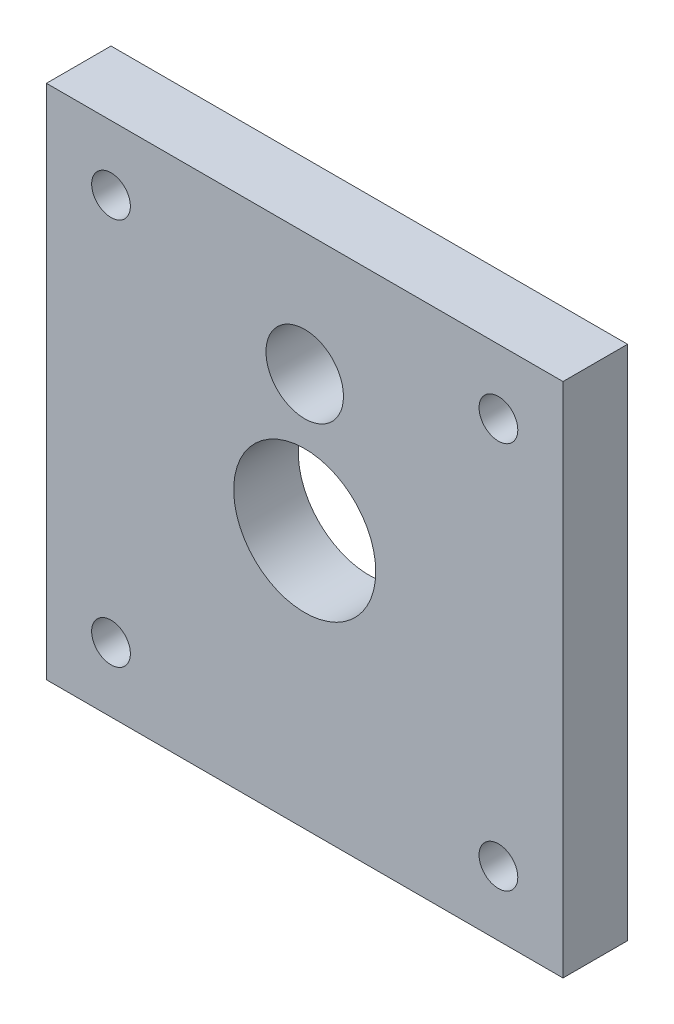
ISO-10303-21;
HEADER;
FILE_DESCRIPTION(('STEP AP214'),'2;1');
FILE_NAME('part.step','',(''),(''),'','','');
FILE_SCHEMA(('AUTOMOTIVE_DESIGN { 1 0 10303 214 1 1 1 1 }'));
ENDSEC;
DATA;
#1=APPLICATION_CONTEXT('core data for automotive mechanical design processes');
#2=APPLICATION_PROTOCOL_DEFINITION('international standard','automotive_design',2000,#1);
#3=PRODUCT_CONTEXT('',#1,'mechanical');
#4=PRODUCT('Part','Part','',(#3));
#5=PRODUCT_RELATED_PRODUCT_CATEGORY('part','',(#4));
#6=PRODUCT_DEFINITION_FORMATION('','',#4);
#7=PRODUCT_DEFINITION_CONTEXT('part definition',#1,'design');
#8=PRODUCT_DEFINITION('design','',#6,#7);
#9=PRODUCT_DEFINITION_SHAPE('','',#8);
#10=(LENGTH_UNIT() NAMED_UNIT(*) SI_UNIT(.MILLI.,.METRE.));
#11=(NAMED_UNIT(*) PLANE_ANGLE_UNIT() SI_UNIT($,.RADIAN.));
#12=(NAMED_UNIT(*) SI_UNIT($,.STERADIAN.) SOLID_ANGLE_UNIT());
#13=UNCERTAINTY_MEASURE_WITH_UNIT(LENGTH_MEASURE(1.E-05),#10,'distance_accuracy_value','');
#14=(GEOMETRIC_REPRESENTATION_CONTEXT(3) GLOBAL_UNCERTAINTY_ASSIGNED_CONTEXT((#13)) GLOBAL_UNIT_ASSIGNED_CONTEXT((#10,
#11,#12)) REPRESENTATION_CONTEXT('',''));
#15=CARTESIAN_POINT('',(0.,0.,0.));
#16=DIRECTION('',(0.,0.,1.));
#17=DIRECTION('',(1.,0.,0.));
#18=AXIS2_PLACEMENT_3D('',#15,#16,#17);
#19=CARTESIAN_POINT('',(0.,0.,5.));
#20=DIRECTION('',(0.,0.,1.));
#21=DIRECTION('',(1.,0.,0.));
#22=AXIS2_PLACEMENT_3D('',#19,#20,#21);
#23=PLANE('',#22);
#24=DIRECTION('',(0.,-1.,0.));
#25=VECTOR('',#24,1.);
#26=CARTESIAN_POINT('',(20.,0.,5.));
#27=LINE('',#26,#25);
#28=CARTESIAN_POINT('',(20.,20.,5.));
#29=VERTEX_POINT('',#28);
#30=CARTESIAN_POINT('',(20.,-20.,5.));
#31=VERTEX_POINT('',#30);
#32=EDGE_CURVE('E120',#29,#31,#27,.T.);
#33=ORIENTED_EDGE('',*,*,#32,.F.);
#34=DIRECTION('',(1.,0.,0.));
#35=VECTOR('',#34,1.);
#36=CARTESIAN_POINT('',(0.,20.,5.));
#37=LINE('',#36,#35);
#38=CARTESIAN_POINT('',(-20.,20.,5.));
#39=VERTEX_POINT('',#38);
#40=EDGE_CURVE('E107',#39,#29,#37,.T.);
#41=ORIENTED_EDGE('',*,*,#40,.F.);
#42=DIRECTION('',(0.,-1.,0.));
#43=VECTOR('',#42,1.);
#44=CARTESIAN_POINT('',(-20.,0.,5.));
#45=LINE('',#44,#43);
#46=CARTESIAN_POINT('',(-20.,-20.,5.));
#47=VERTEX_POINT('',#46);
#48=EDGE_CURVE('E115',#39,#47,#45,.T.);
#49=ORIENTED_EDGE('',*,*,#48,.T.);
#50=DIRECTION('',(1.,0.,0.));
#51=VECTOR('',#50,1.);
#52=CARTESIAN_POINT('',(0.,-20.,5.));
#53=LINE('',#52,#51);
#54=EDGE_CURVE('E74',#47,#31,#53,.T.);
#55=ORIENTED_EDGE('',*,*,#54,.T.);
#56=EDGE_LOOP('',(#33,#41,#49,#55));
#57=FACE_BOUND('',#56,.T.);
#58=CARTESIAN_POINT('',(0.,0.,5.));
#59=DIRECTION('',(0.,0.,1.));
#60=DIRECTION('',(1.,0.,0.));
#61=AXIS2_PLACEMENT_3D('',#58,#59,#60);
#62=CIRCLE('',#61,5.5);
#63=CARTESIAN_POINT('',(5.5,0.,5.));
#64=VERTEX_POINT('',#63);
#65=EDGE_CURVE('E124',#64,#64,#62,.T.);
#66=ORIENTED_EDGE('',*,*,#65,.F.);
#67=EDGE_LOOP('',(#66));
#68=FACE_BOUND('',#67,.T.);
#69=CARTESIAN_POINT('',(-15.,15.,5.));
#70=DIRECTION('',(0.,0.,1.));
#71=DIRECTION('',(1.,0.,0.));
#72=AXIS2_PLACEMENT_3D('',#69,#70,#71);
#73=CIRCLE('',#72,1.5);
#74=CARTESIAN_POINT('',(-13.5,15.,5.));
#75=VERTEX_POINT('',#74);
#76=EDGE_CURVE('E235',#75,#75,#73,.T.);
#77=ORIENTED_EDGE('',*,*,#76,.F.);
#78=EDGE_LOOP('',(#77));
#79=FACE_BOUND('',#78,.T.);
#80=CARTESIAN_POINT('',(15.,15.,5.));
#81=DIRECTION('',(0.,0.,1.));
#82=DIRECTION('',(1.,0.,0.));
#83=AXIS2_PLACEMENT_3D('',#80,#81,#82);
#84=CIRCLE('',#83,1.5);
#85=CARTESIAN_POINT('',(16.5,15.,5.));
#86=VERTEX_POINT('',#85);
#87=EDGE_CURVE('E230',#86,#86,#84,.T.);
#88=ORIENTED_EDGE('',*,*,#87,.F.);
#89=EDGE_LOOP('',(#88));
#90=FACE_BOUND('',#89,.T.);
#91=CARTESIAN_POINT('',(15.,-15.,5.));
#92=DIRECTION('',(0.,0.,1.));
#93=DIRECTION('',(1.,0.,0.));
#94=AXIS2_PLACEMENT_3D('',#91,#92,#93);
#95=CIRCLE('',#94,1.5);
#96=CARTESIAN_POINT('',(16.5,-15.,5.));
#97=VERTEX_POINT('',#96);
#98=EDGE_CURVE('E217',#97,#97,#95,.T.);
#99=ORIENTED_EDGE('',*,*,#98,.F.);
#100=EDGE_LOOP('',(#99));
#101=FACE_BOUND('',#100,.T.);
#102=CARTESIAN_POINT('',(-15.,-15.,5.));
#103=DIRECTION('',(0.,0.,1.));
#104=DIRECTION('',(1.,0.,0.));
#105=AXIS2_PLACEMENT_3D('',#102,#103,#104);
#106=CIRCLE('',#105,1.5);
#107=CARTESIAN_POINT('',(-13.5,-15.,5.));
#108=VERTEX_POINT('',#107);
#109=EDGE_CURVE('E161',#108,#108,#106,.T.);
#110=ORIENTED_EDGE('',*,*,#109,.F.);
#111=EDGE_LOOP('',(#110));
#112=FACE_BOUND('',#111,.T.);
#113=CARTESIAN_POINT('',(0.,10.5,5.));
#114=DIRECTION('',(0.,0.,1.));
#115=DIRECTION('',(1.,0.,0.));
#116=AXIS2_PLACEMENT_3D('',#113,#114,#115);
#117=CIRCLE('',#116,3.);
#118=CARTESIAN_POINT('',(3.,10.5,5.));
#119=VERTEX_POINT('',#118);
#120=EDGE_CURVE('E135',#119,#119,#117,.T.);
#121=ORIENTED_EDGE('',*,*,#120,.F.);
#122=EDGE_LOOP('',(#121));
#123=FACE_BOUND('',#122,.T.);
#124=ADVANCED_FACE('F56',(#57,#68,#79,#90,#101,#112,#123),#23,.T.);
#125=CARTESIAN_POINT('',(0.,0.,0.));
#126=DIRECTION('',(0.,0.,1.));
#127=DIRECTION('',(1.,0.,0.));
#128=AXIS2_PLACEMENT_3D('',#125,#126,#127);
#129=PLANE('',#128);
#130=CARTESIAN_POINT('',(-15.,-15.,0.));
#131=DIRECTION('',(0.,0.,1.));
#132=DIRECTION('',(1.,0.,0.));
#133=AXIS2_PLACEMENT_3D('',#130,#131,#132);
#134=CIRCLE('',#133,1.5);
#135=CARTESIAN_POINT('',(-13.5,-15.,0.));
#136=VERTEX_POINT('',#135);
#137=EDGE_CURVE('E130',#136,#136,#134,.T.);
#138=ORIENTED_EDGE('',*,*,#137,.T.);
#139=EDGE_LOOP('',(#138));
#140=FACE_BOUND('',#139,.T.);
#141=CARTESIAN_POINT('',(15.,-15.,0.));
#142=DIRECTION('',(0.,0.,1.));
#143=DIRECTION('',(1.,0.,0.));
#144=AXIS2_PLACEMENT_3D('',#141,#142,#143);
#145=CIRCLE('',#144,1.5);
#146=CARTESIAN_POINT('',(16.5,-15.,0.));
#147=VERTEX_POINT('',#146);
#148=EDGE_CURVE('E134',#147,#147,#145,.T.);
#149=ORIENTED_EDGE('',*,*,#148,.T.);
#150=EDGE_LOOP('',(#149));
#151=FACE_BOUND('',#150,.T.);
#152=CARTESIAN_POINT('',(15.,15.,0.));
#153=DIRECTION('',(0.,0.,1.));
#154=DIRECTION('',(1.,0.,0.));
#155=AXIS2_PLACEMENT_3D('',#152,#153,#154);
#156=CIRCLE('',#155,1.5);
#157=CARTESIAN_POINT('',(16.5,15.,0.));
#158=VERTEX_POINT('',#157);
#159=EDGE_CURVE('E139',#158,#158,#156,.T.);
#160=ORIENTED_EDGE('',*,*,#159,.T.);
#161=EDGE_LOOP('',(#160));
#162=FACE_BOUND('',#161,.T.);
#163=CARTESIAN_POINT('',(-15.,15.,0.));
#164=DIRECTION('',(0.,0.,1.));
#165=DIRECTION('',(1.,0.,0.));
#166=AXIS2_PLACEMENT_3D('',#163,#164,#165);
#167=CIRCLE('',#166,1.5);
#168=CARTESIAN_POINT('',(-13.5,15.,0.));
#169=VERTEX_POINT('',#168);
#170=EDGE_CURVE('E143',#169,#169,#167,.T.);
#171=ORIENTED_EDGE('',*,*,#170,.T.);
#172=EDGE_LOOP('',(#171));
#173=FACE_BOUND('',#172,.T.);
#174=CARTESIAN_POINT('',(0.,0.,0.));
#175=DIRECTION('',(0.,0.,1.));
#176=DIRECTION('',(1.,0.,0.));
#177=AXIS2_PLACEMENT_3D('',#174,#175,#176);
#178=CIRCLE('',#177,5.5);
#179=CARTESIAN_POINT('',(5.5,0.,0.));
#180=VERTEX_POINT('',#179);
#181=EDGE_CURVE('E147',#180,#180,#178,.T.);
#182=ORIENTED_EDGE('',*,*,#181,.T.);
#183=EDGE_LOOP('',(#182));
#184=FACE_BOUND('',#183,.T.);
#185=DIRECTION('',(0.,-1.,0.));
#186=VECTOR('',#185,1.);
#187=CARTESIAN_POINT('',(20.,0.,0.));
#188=LINE('',#187,#186);
#189=CARTESIAN_POINT('',(20.,20.,0.));
#190=VERTEX_POINT('',#189);
#191=CARTESIAN_POINT('',(20.,-20.,0.));
#192=VERTEX_POINT('',#191);
#193=EDGE_CURVE('E151',#190,#192,#188,.T.);
#194=ORIENTED_EDGE('',*,*,#193,.T.);
#195=DIRECTION('',(1.,0.,0.));
#196=VECTOR('',#195,1.);
#197=CARTESIAN_POINT('',(0.,-20.,0.));
#198=LINE('',#197,#196);
#199=CARTESIAN_POINT('',(-20.,-20.,0.));
#200=VERTEX_POINT('',#199);
#201=EDGE_CURVE('E90',#200,#192,#198,.T.);
#202=ORIENTED_EDGE('',*,*,#201,.F.);
#203=DIRECTION('',(0.,-1.,0.));
#204=VECTOR('',#203,1.);
#205=CARTESIAN_POINT('',(-20.,0.,0.));
#206=LINE('',#205,#204);
#207=CARTESIAN_POINT('',(-20.,20.,0.));
#208=VERTEX_POINT('',#207);
#209=EDGE_CURVE('E156',#208,#200,#206,.T.);
#210=ORIENTED_EDGE('',*,*,#209,.F.);
#211=DIRECTION('',(1.,0.,0.));
#212=VECTOR('',#211,1.);
#213=CARTESIAN_POINT('',(0.,20.,0.));
#214=LINE('',#213,#212);
#215=EDGE_CURVE('E109',#208,#190,#214,.T.);
#216=ORIENTED_EDGE('',*,*,#215,.T.);
#217=EDGE_LOOP('',(#194,#202,#210,#216));
#218=FACE_BOUND('',#217,.T.);
#219=CARTESIAN_POINT('',(0.,10.5,0.));
#220=DIRECTION('',(0.,0.,1.));
#221=DIRECTION('',(1.,0.,0.));
#222=AXIS2_PLACEMENT_3D('',#219,#220,#221);
#223=CIRCLE('',#222,3.);
#224=CARTESIAN_POINT('',(3.,10.5,0.));
#225=VERTEX_POINT('',#224);
#226=EDGE_CURVE('E256',#225,#225,#223,.T.);
#227=ORIENTED_EDGE('',*,*,#226,.T.);
#228=EDGE_LOOP('',(#227));
#229=FACE_BOUND('',#228,.T.);
#230=ADVANCED_FACE('F167',(#140,#151,#162,#173,#184,#218,#229),#129,.F.);
#231=CARTESIAN_POINT('',(20.,0.,5.));
#232=DIRECTION('',(1.,0.,0.));
#233=DIRECTION('',(0.,1.,0.));
#234=AXIS2_PLACEMENT_3D('',#231,#232,#233);
#235=PLANE('',#234);
#236=ORIENTED_EDGE('',*,*,#193,.F.);
#237=DIRECTION('',(0.,0.,-1.));
#238=VECTOR('',#237,1.);
#239=CARTESIAN_POINT('',(20.,20.,5.));
#240=LINE('',#239,#238);
#241=EDGE_CURVE('E12',#29,#190,#240,.T.);
#242=ORIENTED_EDGE('',*,*,#241,.F.);
#243=ORIENTED_EDGE('',*,*,#32,.T.);
#244=DIRECTION('',(0.,0.,-1.));
#245=VECTOR('',#244,1.);
#246=CARTESIAN_POINT('',(20.,-20.,5.));
#247=LINE('',#246,#245);
#248=EDGE_CURVE('E97',#31,#192,#247,.T.);
#249=ORIENTED_EDGE('',*,*,#248,.T.);
#250=EDGE_LOOP('',(#236,#242,#243,#249));
#251=FACE_BOUND('',#250,.T.);
#252=ADVANCED_FACE('F169',(#251),#235,.T.);
#253=CARTESIAN_POINT('',(0.,20.,5.));
#254=DIRECTION('',(0.,1.,0.));
#255=DIRECTION('',(0.,0.,1.));
#256=AXIS2_PLACEMENT_3D('',#253,#254,#255);
#257=PLANE('',#256);
#258=ORIENTED_EDGE('',*,*,#215,.F.);
#259=DIRECTION('',(0.,0.,-1.));
#260=VECTOR('',#259,1.);
#261=CARTESIAN_POINT('',(-20.,20.,5.));
#262=LINE('',#261,#260);
#263=EDGE_CURVE('E66',#39,#208,#262,.T.);
#264=ORIENTED_EDGE('',*,*,#263,.F.);
#265=ORIENTED_EDGE('',*,*,#40,.T.);
#266=ORIENTED_EDGE('',*,*,#241,.T.);
#267=EDGE_LOOP('',(#258,#264,#265,#266));
#268=FACE_BOUND('',#267,.T.);
#269=ADVANCED_FACE('F105',(#268),#257,.T.);
#270=CARTESIAN_POINT('',(-20.,0.,5.));
#271=DIRECTION('',(1.,0.,0.));
#272=DIRECTION('',(0.,1.,0.));
#273=AXIS2_PLACEMENT_3D('',#270,#271,#272);
#274=PLANE('',#273);
#275=ORIENTED_EDGE('',*,*,#209,.T.);
#276=DIRECTION('',(0.,0.,-1.));
#277=VECTOR('',#276,1.);
#278=CARTESIAN_POINT('',(-20.,-20.,5.));
#279=LINE('',#278,#277);
#280=EDGE_CURVE('E113',#47,#200,#279,.T.);
#281=ORIENTED_EDGE('',*,*,#280,.F.);
#282=ORIENTED_EDGE('',*,*,#48,.F.);
#283=ORIENTED_EDGE('',*,*,#263,.T.);
#284=EDGE_LOOP('',(#275,#281,#282,#283));
#285=FACE_BOUND('',#284,.T.);
#286=ADVANCED_FACE('F116',(#285),#274,.F.);
#287=CARTESIAN_POINT('',(0.,0.,5.));
#288=DIRECTION('',(0.,0.,-1.));
#289=DIRECTION('',(-1.,0.,0.));
#290=AXIS2_PLACEMENT_3D('',#287,#288,#289);
#291=CYLINDRICAL_SURFACE('',#290,5.5);
#292=ORIENTED_EDGE('',*,*,#65,.T.);
#293=EDGE_LOOP('',(#292));
#294=FACE_BOUND('',#293,.T.);
#295=ORIENTED_EDGE('',*,*,#181,.F.);
#296=EDGE_LOOP('',(#295));
#297=FACE_BOUND('',#296,.T.);
#298=ADVANCED_FACE('F190',(#294,#297),#291,.F.);
#299=CARTESIAN_POINT('',(-15.,15.,5.));
#300=DIRECTION('',(0.,0.,-1.));
#301=DIRECTION('',(-1.,0.,0.));
#302=AXIS2_PLACEMENT_3D('',#299,#300,#301);
#303=CYLINDRICAL_SURFACE('',#302,1.5);
#304=ORIENTED_EDGE('',*,*,#76,.T.);
#305=EDGE_LOOP('',(#304));
#306=FACE_BOUND('',#305,.T.);
#307=ORIENTED_EDGE('',*,*,#170,.F.);
#308=EDGE_LOOP('',(#307));
#309=FACE_BOUND('',#308,.T.);
#310=ADVANCED_FACE('F194',(#306,#309),#303,.F.);
#311=CARTESIAN_POINT('',(15.,15.,5.));
#312=DIRECTION('',(0.,0.,-1.));
#313=DIRECTION('',(-1.,0.,0.));
#314=AXIS2_PLACEMENT_3D('',#311,#312,#313);
#315=CYLINDRICAL_SURFACE('',#314,1.5);
#316=ORIENTED_EDGE('',*,*,#87,.T.);
#317=EDGE_LOOP('',(#316));
#318=FACE_BOUND('',#317,.T.);
#319=ORIENTED_EDGE('',*,*,#159,.F.);
#320=EDGE_LOOP('',(#319));
#321=FACE_BOUND('',#320,.T.);
#322=ADVANCED_FACE('F199',(#318,#321),#315,.F.);
#323=CARTESIAN_POINT('',(15.,-15.,5.));
#324=DIRECTION('',(0.,0.,-1.));
#325=DIRECTION('',(-1.,0.,0.));
#326=AXIS2_PLACEMENT_3D('',#323,#324,#325);
#327=CYLINDRICAL_SURFACE('',#326,1.5);
#328=ORIENTED_EDGE('',*,*,#98,.T.);
#329=EDGE_LOOP('',(#328));
#330=FACE_BOUND('',#329,.T.);
#331=ORIENTED_EDGE('',*,*,#148,.F.);
#332=EDGE_LOOP('',(#331));
#333=FACE_BOUND('',#332,.T.);
#334=ADVANCED_FACE('F206',(#330,#333),#327,.F.);
#335=CARTESIAN_POINT('',(-15.,-15.,5.));
#336=DIRECTION('',(0.,0.,-1.));
#337=DIRECTION('',(-1.,0.,0.));
#338=AXIS2_PLACEMENT_3D('',#335,#336,#337);
#339=CYLINDRICAL_SURFACE('',#338,1.5);
#340=ORIENTED_EDGE('',*,*,#109,.T.);
#341=EDGE_LOOP('',(#340));
#342=FACE_BOUND('',#341,.T.);
#343=ORIENTED_EDGE('',*,*,#137,.F.);
#344=EDGE_LOOP('',(#343));
#345=FACE_BOUND('',#344,.T.);
#346=ADVANCED_FACE('F58',(#342,#345),#339,.F.);
#347=CARTESIAN_POINT('',(0.,-20.,5.));
#348=DIRECTION('',(0.,1.,0.));
#349=DIRECTION('',(0.,0.,1.));
#350=AXIS2_PLACEMENT_3D('',#347,#348,#349);
#351=PLANE('',#350);
#352=ORIENTED_EDGE('',*,*,#201,.T.);
#353=ORIENTED_EDGE('',*,*,#248,.F.);
#354=ORIENTED_EDGE('',*,*,#54,.F.);
#355=ORIENTED_EDGE('',*,*,#280,.T.);
#356=EDGE_LOOP('',(#352,#353,#354,#355));
#357=FACE_BOUND('',#356,.T.);
#358=ADVANCED_FACE('F166',(#357),#351,.F.);
#359=CARTESIAN_POINT('',(0.,10.5,5.));
#360=DIRECTION('',(0.,0.,-1.));
#361=DIRECTION('',(-1.,0.,0.));
#362=AXIS2_PLACEMENT_3D('',#359,#360,#361);
#363=CYLINDRICAL_SURFACE('',#362,3.);
#364=ORIENTED_EDGE('',*,*,#120,.T.);
#365=EDGE_LOOP('',(#364));
#366=FACE_BOUND('',#365,.T.);
#367=ORIENTED_EDGE('',*,*,#226,.F.);
#368=EDGE_LOOP('',(#367));
#369=FACE_BOUND('',#368,.T.);
#370=ADVANCED_FACE('F185',(#366,#369),#363,.F.);
#371=CLOSED_SHELL('',(#124,#230,#252,#269,#286,#298,#310,#322,#334,#346,#358,#370));
#372=MANIFOLD_SOLID_BREP('B2',#371);
#373=ADVANCED_BREP_SHAPE_REPRESENTATION('',(#18,#372),#14);
#374=SHAPE_DEFINITION_REPRESENTATION(#9,#373);
ENDSEC;
END-ISO-10303-21;
